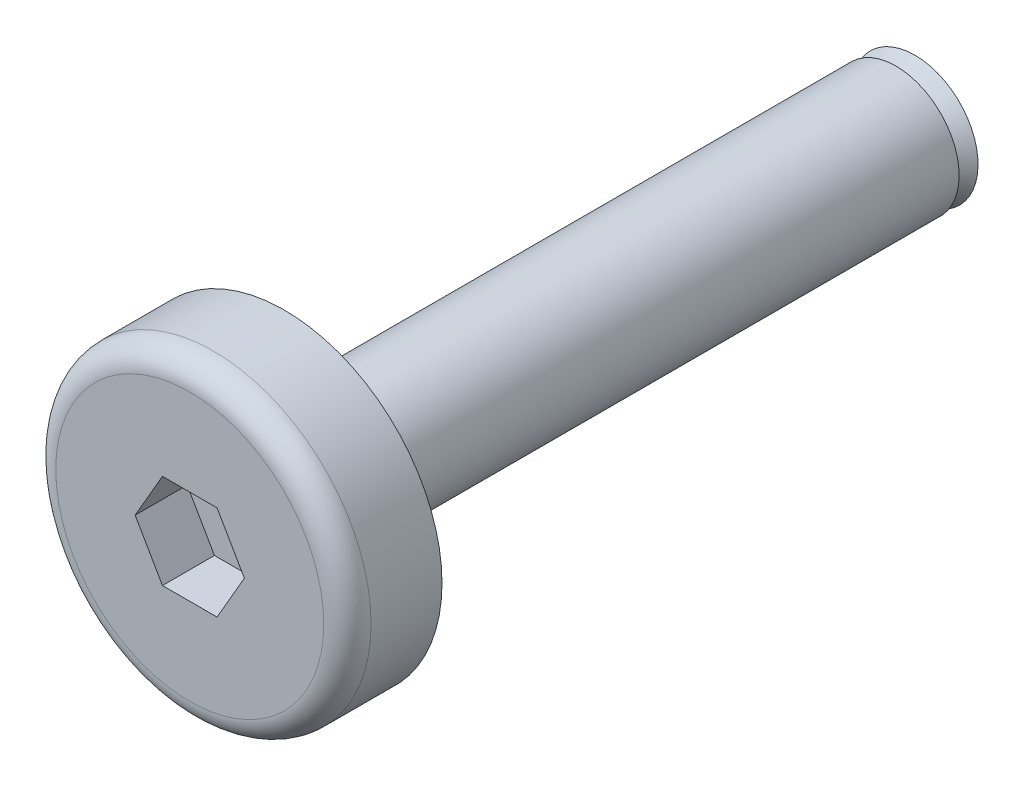
ISO-10303-21;
HEADER;
FILE_DESCRIPTION(('STEP AP214'),'2;1');
FILE_NAME('part.step','',(''),(''),'','','');
FILE_SCHEMA(('AUTOMOTIVE_DESIGN { 1 0 10303 214 1 1 1 1 }'));
ENDSEC;
DATA;
#1=APPLICATION_CONTEXT('core data for automotive mechanical design processes');
#2=APPLICATION_PROTOCOL_DEFINITION('international standard','automotive_design',2000,#1);
#3=PRODUCT_CONTEXT('',#1,'mechanical');
#4=PRODUCT('Part','Part','',(#3));
#5=PRODUCT_RELATED_PRODUCT_CATEGORY('part','',(#4));
#6=PRODUCT_DEFINITION_FORMATION('','',#4);
#7=PRODUCT_DEFINITION_CONTEXT('part definition',#1,'design');
#8=PRODUCT_DEFINITION('design','',#6,#7);
#9=PRODUCT_DEFINITION_SHAPE('','',#8);
#10=(LENGTH_UNIT() NAMED_UNIT(*) SI_UNIT(.MILLI.,.METRE.));
#11=(NAMED_UNIT(*) PLANE_ANGLE_UNIT() SI_UNIT($,.RADIAN.));
#12=(NAMED_UNIT(*) SI_UNIT($,.STERADIAN.) SOLID_ANGLE_UNIT());
#13=UNCERTAINTY_MEASURE_WITH_UNIT(LENGTH_MEASURE(1.E-05),#10,'distance_accuracy_value','');
#14=(GEOMETRIC_REPRESENTATION_CONTEXT(3) GLOBAL_UNCERTAINTY_ASSIGNED_CONTEXT((#13)) GLOBAL_UNIT_ASSIGNED_CONTEXT((#10,
#11,#12)) REPRESENTATION_CONTEXT('',''));
#15=CARTESIAN_POINT('',(0.,0.,0.));
#16=DIRECTION('',(0.,0.,1.));
#17=DIRECTION('',(1.,0.,0.));
#18=AXIS2_PLACEMENT_3D('',#15,#16,#17);
#19=CARTESIAN_POINT('',(0.,0.,1.5));
#20=DIRECTION('',(0.,0.,1.));
#21=DIRECTION('',(1.,0.,0.));
#22=AXIS2_PLACEMENT_3D('',#19,#20,#21);
#23=PLANE('',#22);
#24=CARTESIAN_POINT('',(0.,0.,1.5));
#25=DIRECTION('',(0.,0.,1.));
#26=DIRECTION('',(1.,0.,0.));
#27=AXIS2_PLACEMENT_3D('',#24,#25,#26);
#28=CIRCLE('',#27,2.125);
#29=CARTESIAN_POINT('',(2.125,0.,1.5));
#30=VERTEX_POINT('',#29);
#31=EDGE_CURVE('E142',#30,#30,#28,.T.);
#32=ORIENTED_EDGE('',*,*,#31,.T.);
#33=EDGE_LOOP('',(#32));
#34=FACE_BOUND('',#33,.T.);
#35=DIRECTION('',(0.5,-0.866025403784439,0.));
#36=VECTOR('',#35,1.);
#37=CARTESIAN_POINT('',(0.649519052838329,0.375,1.5));
#38=LINE('',#37,#36);
#39=CARTESIAN_POINT('',(0.433012701892219,0.75,1.5));
#40=VERTEX_POINT('',#39);
#41=CARTESIAN_POINT('',(0.866025403784439,0.,1.5));
#42=VERTEX_POINT('',#41);
#43=EDGE_CURVE('E51',#40,#42,#38,.T.);
#44=ORIENTED_EDGE('',*,*,#43,.T.);
#45=DIRECTION('',(-0.5,-0.866025403784439,0.));
#46=VECTOR('',#45,1.);
#47=CARTESIAN_POINT('',(0.649519052838329,-0.375,1.5));
#48=LINE('',#47,#46);
#49=CARTESIAN_POINT('',(0.433012701892219,-0.75,1.5));
#50=VERTEX_POINT('',#49);
#51=EDGE_CURVE('E11',#42,#50,#48,.T.);
#52=ORIENTED_EDGE('',*,*,#51,.T.);
#53=DIRECTION('',(-1.,0.,0.));
#54=VECTOR('',#53,1.);
#55=CARTESIAN_POINT('',(0.,-0.75,1.5));
#56=LINE('',#55,#54);
#57=CARTESIAN_POINT('',(-0.43301270189222,-0.75,1.5));
#58=VERTEX_POINT('',#57);
#59=EDGE_CURVE('E148',#50,#58,#56,.T.);
#60=ORIENTED_EDGE('',*,*,#59,.T.);
#61=DIRECTION('',(-0.5,0.866025403784439,0.));
#62=VECTOR('',#61,1.);
#63=CARTESIAN_POINT('',(-0.649519052838329,-0.375,1.5));
#64=LINE('',#63,#62);
#65=CARTESIAN_POINT('',(-0.866025403784439,0.,1.5));
#66=VERTEX_POINT('',#65);
#67=EDGE_CURVE('E151',#58,#66,#64,.T.);
#68=ORIENTED_EDGE('',*,*,#67,.T.);
#69=DIRECTION('',(0.5,0.866025403784438,0.));
#70=VECTOR('',#69,1.);
#71=CARTESIAN_POINT('',(-0.649519052838329,0.375,1.5));
#72=LINE('',#71,#70);
#73=CARTESIAN_POINT('',(-0.433012701892219,0.75,1.5));
#74=VERTEX_POINT('',#73);
#75=EDGE_CURVE('E154',#66,#74,#72,.T.);
#76=ORIENTED_EDGE('',*,*,#75,.T.);
#77=DIRECTION('',(1.,0.,0.));
#78=VECTOR('',#77,1.);
#79=CARTESIAN_POINT('',(0.,0.75,1.5));
#80=LINE('',#79,#78);
#81=EDGE_CURVE('E157',#74,#40,#80,.T.);
#82=ORIENTED_EDGE('',*,*,#81,.T.);
#83=EDGE_LOOP('',(#44,#52,#60,#68,#76,#82));
#84=FACE_BOUND('',#83,.T.);
#85=ADVANCED_FACE('F43',(#34,#84),#23,.T.);
#86=CARTESIAN_POINT('',(0.,0.,1.5));
#87=DIRECTION('',(0.,0.,-1.));
#88=DIRECTION('',(-1.,0.,0.));
#89=AXIS2_PLACEMENT_3D('',#86,#87,#88);
#90=CYLINDRICAL_SURFACE('',#89,2.5);
#91=CARTESIAN_POINT('',(0.,0.,1.125));
#92=DIRECTION('',(0.,0.,1.));
#93=DIRECTION('',(1.,0.,0.));
#94=AXIS2_PLACEMENT_3D('',#91,#92,#93);
#95=CIRCLE('',#94,2.5);
#96=CARTESIAN_POINT('',(2.5,0.,1.125));
#97=VERTEX_POINT('',#96);
#98=EDGE_CURVE('E145',#97,#97,#95,.F.);
#99=ORIENTED_EDGE('',*,*,#98,.T.);
#100=EDGE_LOOP('',(#99));
#101=FACE_BOUND('',#100,.T.);
#102=CARTESIAN_POINT('',(0.,0.,0.));
#103=DIRECTION('',(0.,0.,1.));
#104=DIRECTION('',(1.,0.,0.));
#105=AXIS2_PLACEMENT_3D('',#102,#103,#104);
#106=CIRCLE('',#105,2.5);
#107=CARTESIAN_POINT('',(2.5,0.,0.));
#108=VERTEX_POINT('',#107);
#109=EDGE_CURVE('E100',#108,#108,#106,.T.);
#110=ORIENTED_EDGE('',*,*,#109,.T.);
#111=EDGE_LOOP('',(#110));
#112=FACE_BOUND('',#111,.T.);
#113=ADVANCED_FACE('F181',(#101,#112),#90,.T.);
#114=CARTESIAN_POINT('',(0.,0.,0.));
#115=DIRECTION('',(0.,0.,1.));
#116=DIRECTION('',(1.,0.,0.));
#117=AXIS2_PLACEMENT_3D('',#114,#115,#116);
#118=PLANE('',#117);
#119=CARTESIAN_POINT('',(0.,0.,0.));
#120=DIRECTION('',(0.,0.,1.));
#121=DIRECTION('',(1.,0.,0.));
#122=AXIS2_PLACEMENT_3D('',#119,#120,#121);
#123=CIRCLE('',#122,1.);
#124=CARTESIAN_POINT('',(1.,0.,0.));
#125=VERTEX_POINT('',#124);
#126=EDGE_CURVE('E119',#125,#125,#123,.T.);
#127=ORIENTED_EDGE('',*,*,#126,.T.);
#128=EDGE_LOOP('',(#127));
#129=FACE_BOUND('',#128,.T.);
#130=ORIENTED_EDGE('',*,*,#109,.F.);
#131=EDGE_LOOP('',(#130));
#132=FACE_BOUND('',#131,.T.);
#133=ADVANCED_FACE('F187',(#129,#132),#118,.F.);
#134=CARTESIAN_POINT('',(0.,0.,1.125));
#135=DIRECTION('',(0.,0.,1.));
#136=DIRECTION('',(1.,0.,0.));
#137=AXIS2_PLACEMENT_3D('',#134,#135,#136);
#138=TOROIDAL_SURFACE('',#137,2.125,0.375);
#139=ORIENTED_EDGE('',*,*,#98,.F.);
#140=EDGE_LOOP('',(#139));
#141=FACE_BOUND('',#140,.T.);
#142=ORIENTED_EDGE('',*,*,#31,.F.);
#143=EDGE_LOOP('',(#142));
#144=FACE_BOUND('',#143,.T.);
#145=ADVANCED_FACE('F45',(#141,#144),#138,.T.);
#146=CARTESIAN_POINT('',(0.433012701892219,-0.75,1.51));
#147=DIRECTION('',(-0.866025403784439,0.5,0.));
#148=DIRECTION('',(-0.5,-0.866025403784439,0.));
#149=AXIS2_PLACEMENT_3D('',#146,#147,#148);
#150=PLANE('',#149);
#151=DIRECTION('',(0.,0.,-1.));
#152=VECTOR('',#151,1.);
#153=CARTESIAN_POINT('',(0.866025403784439,0.,1.51));
#154=LINE('',#153,#152);
#155=CARTESIAN_POINT('',(0.866025403784439,0.,0.675));
#156=VERTEX_POINT('',#155);
#157=EDGE_CURVE('E93',#42,#156,#154,.T.);
#158=ORIENTED_EDGE('',*,*,#157,.T.);
#159=DIRECTION('',(0.5,0.866025403784439,0.));
#160=VECTOR('',#159,1.);
#161=CARTESIAN_POINT('',(0.433012701892219,-0.75,0.675));
#162=LINE('',#161,#160);
#163=CARTESIAN_POINT('',(0.433012701892219,-0.75,0.675));
#164=VERTEX_POINT('',#163);
#165=EDGE_CURVE('E97',#164,#156,#162,.T.);
#166=ORIENTED_EDGE('',*,*,#165,.F.);
#167=DIRECTION('',(0.,0.,-1.));
#168=VECTOR('',#167,1.);
#169=CARTESIAN_POINT('',(0.433012701892219,-0.75,1.51));
#170=LINE('',#169,#168);
#171=EDGE_CURVE('E132',#50,#164,#170,.T.);
#172=ORIENTED_EDGE('',*,*,#171,.F.);
#173=ORIENTED_EDGE('',*,*,#51,.F.);
#174=EDGE_LOOP('',(#158,#166,#172,#173));
#175=FACE_BOUND('',#174,.T.);
#176=ADVANCED_FACE('F95',(#175),#150,.T.);
#177=CARTESIAN_POINT('',(0.866025403784439,0.,1.51));
#178=DIRECTION('',(-0.866025403784439,-0.5,0.));
#179=DIRECTION('',(0.,0.,1.));
#180=AXIS2_PLACEMENT_3D('',#177,#178,#179);
#181=PLANE('',#180);
#182=DIRECTION('',(0.,0.,-1.));
#183=VECTOR('',#182,1.);
#184=CARTESIAN_POINT('',(0.433012701892219,0.75,1.51));
#185=LINE('',#184,#183);
#186=CARTESIAN_POINT('',(0.433012701892219,0.75,0.675));
#187=VERTEX_POINT('',#186);
#188=EDGE_CURVE('E101',#40,#187,#185,.T.);
#189=ORIENTED_EDGE('',*,*,#188,.T.);
#190=DIRECTION('',(-0.5,0.866025403784439,0.));
#191=VECTOR('',#190,1.);
#192=CARTESIAN_POINT('',(0.866025403784439,0.,0.675));
#193=LINE('',#192,#191);
#194=EDGE_CURVE('E104',#156,#187,#193,.T.);
#195=ORIENTED_EDGE('',*,*,#194,.F.);
#196=ORIENTED_EDGE('',*,*,#157,.F.);
#197=ORIENTED_EDGE('',*,*,#43,.F.);
#198=EDGE_LOOP('',(#189,#195,#196,#197));
#199=FACE_BOUND('',#198,.T.);
#200=ADVANCED_FACE('F105',(#199),#181,.T.);
#201=CARTESIAN_POINT('',(0.433012701892219,0.75,1.51));
#202=DIRECTION('',(0.,-1.,0.));
#203=DIRECTION('',(1.,0.,0.));
#204=AXIS2_PLACEMENT_3D('',#201,#202,#203);
#205=PLANE('',#204);
#206=DIRECTION('',(0.,0.,-1.));
#207=VECTOR('',#206,1.);
#208=CARTESIAN_POINT('',(-0.433012701892219,0.75,1.51));
#209=LINE('',#208,#207);
#210=CARTESIAN_POINT('',(-0.433012701892219,0.75,0.675));
#211=VERTEX_POINT('',#210);
#212=EDGE_CURVE('E137',#74,#211,#209,.T.);
#213=ORIENTED_EDGE('',*,*,#212,.T.);
#214=DIRECTION('',(-1.,0.,0.));
#215=VECTOR('',#214,1.);
#216=CARTESIAN_POINT('',(0.433012701892219,0.75,0.675));
#217=LINE('',#216,#215);
#218=EDGE_CURVE('E110',#187,#211,#217,.T.);
#219=ORIENTED_EDGE('',*,*,#218,.F.);
#220=ORIENTED_EDGE('',*,*,#188,.F.);
#221=ORIENTED_EDGE('',*,*,#81,.F.);
#222=EDGE_LOOP('',(#213,#219,#220,#221));
#223=FACE_BOUND('',#222,.T.);
#224=ADVANCED_FACE('F161',(#223),#205,.T.);
#225=CARTESIAN_POINT('',(-0.433012701892219,0.75,1.51));
#226=DIRECTION('',(0.866025403784439,-0.5,0.));
#227=DIRECTION('',(0.500000000000001,0.866025403784439,0.));
#228=AXIS2_PLACEMENT_3D('',#225,#226,#227);
#229=PLANE('',#228);
#230=DIRECTION('',(0.,0.,-1.));
#231=VECTOR('',#230,1.);
#232=CARTESIAN_POINT('',(-0.866025403784439,0.,1.51));
#233=LINE('',#232,#231);
#234=CARTESIAN_POINT('',(-0.866025403784439,0.,0.675));
#235=VERTEX_POINT('',#234);
#236=EDGE_CURVE('E135',#66,#235,#233,.T.);
#237=ORIENTED_EDGE('',*,*,#236,.T.);
#238=DIRECTION('',(-0.5,-0.866025403784439,0.));
#239=VECTOR('',#238,1.);
#240=CARTESIAN_POINT('',(-0.433012701892219,0.75,0.675));
#241=LINE('',#240,#239);
#242=EDGE_CURVE('E126',#211,#235,#241,.T.);
#243=ORIENTED_EDGE('',*,*,#242,.F.);
#244=ORIENTED_EDGE('',*,*,#212,.F.);
#245=ORIENTED_EDGE('',*,*,#75,.F.);
#246=EDGE_LOOP('',(#237,#243,#244,#245));
#247=FACE_BOUND('',#246,.T.);
#248=ADVANCED_FACE('F166',(#247),#229,.T.);
#249=CARTESIAN_POINT('',(-0.866025403784439,0.,1.51));
#250=DIRECTION('',(0.866025403784439,0.5,0.));
#251=DIRECTION('',(0.,0.,-1.));
#252=AXIS2_PLACEMENT_3D('',#249,#250,#251);
#253=PLANE('',#252);
#254=DIRECTION('',(0.,0.,-1.));
#255=VECTOR('',#254,1.);
#256=CARTESIAN_POINT('',(-0.43301270189222,-0.75,1.51));
#257=LINE('',#256,#255);
#258=CARTESIAN_POINT('',(-0.43301270189222,-0.75,0.675));
#259=VERTEX_POINT('',#258);
#260=EDGE_CURVE('E58',#58,#259,#257,.T.);
#261=ORIENTED_EDGE('',*,*,#260,.T.);
#262=DIRECTION('',(0.5,-0.866025403784439,0.));
#263=VECTOR('',#262,1.);
#264=CARTESIAN_POINT('',(-0.866025403784439,0.,0.675));
#265=LINE('',#264,#263);
#266=EDGE_CURVE('E129',#235,#259,#265,.T.);
#267=ORIENTED_EDGE('',*,*,#266,.F.);
#268=ORIENTED_EDGE('',*,*,#236,.F.);
#269=ORIENTED_EDGE('',*,*,#67,.F.);
#270=EDGE_LOOP('',(#261,#267,#268,#269));
#271=FACE_BOUND('',#270,.T.);
#272=ADVANCED_FACE('F169',(#271),#253,.T.);
#273=CARTESIAN_POINT('',(-0.43301270189222,-0.75,1.51));
#274=DIRECTION('',(0.,1.,0.));
#275=DIRECTION('',(-1.,0.,0.));
#276=AXIS2_PLACEMENT_3D('',#273,#274,#275);
#277=PLANE('',#276);
#278=ORIENTED_EDGE('',*,*,#171,.T.);
#279=DIRECTION('',(1.,0.,0.));
#280=VECTOR('',#279,1.);
#281=CARTESIAN_POINT('',(-0.43301270189222,-0.75,0.675));
#282=LINE('',#281,#280);
#283=EDGE_CURVE('E115',#259,#164,#282,.T.);
#284=ORIENTED_EDGE('',*,*,#283,.F.);
#285=ORIENTED_EDGE('',*,*,#260,.F.);
#286=ORIENTED_EDGE('',*,*,#59,.F.);
#287=EDGE_LOOP('',(#278,#284,#285,#286));
#288=FACE_BOUND('',#287,.T.);
#289=ADVANCED_FACE('F170',(#288),#277,.T.);
#290=CARTESIAN_POINT('',(0.866025403784439,0.,0.675));
#291=DIRECTION('',(0.,0.,1.));
#292=DIRECTION('',(-0.5,0.866025403784439,0.));
#293=AXIS2_PLACEMENT_3D('',#290,#291,#292);
#294=PLANE('',#293);
#295=ORIENTED_EDGE('',*,*,#165,.T.);
#296=ORIENTED_EDGE('',*,*,#194,.T.);
#297=ORIENTED_EDGE('',*,*,#218,.T.);
#298=ORIENTED_EDGE('',*,*,#242,.T.);
#299=ORIENTED_EDGE('',*,*,#266,.T.);
#300=ORIENTED_EDGE('',*,*,#283,.T.);
#301=EDGE_LOOP('',(#295,#296,#297,#298,#299,#300));
#302=FACE_BOUND('',#301,.T.);
#303=ADVANCED_FACE('F113',(#302),#294,.T.);
#304=CARTESIAN_POINT('',(0.,0.,0.));
#305=DIRECTION('',(0.,0.,-1.));
#306=DIRECTION('',(-1.,0.,0.));
#307=AXIS2_PLACEMENT_3D('',#304,#305,#306);
#308=CYLINDRICAL_SURFACE('',#307,1.);
#309=ORIENTED_EDGE('',*,*,#126,.F.);
#310=EDGE_LOOP('',(#309));
#311=FACE_BOUND('',#310,.T.);
#312=CARTESIAN_POINT('',(0.,0.,-9.7));
#313=DIRECTION('',(0.,0.,1.));
#314=DIRECTION('',(1.,0.,0.));
#315=AXIS2_PLACEMENT_3D('',#312,#313,#314);
#316=CIRCLE('',#315,1.);
#317=CARTESIAN_POINT('',(1.,0.,-9.7));
#318=VERTEX_POINT('',#317);
#319=EDGE_CURVE('E122',#318,#318,#316,.T.);
#320=ORIENTED_EDGE('',*,*,#319,.T.);
#321=EDGE_LOOP('',(#320));
#322=FACE_BOUND('',#321,.T.);
#323=ADVANCED_FACE('F177',(#311,#322),#308,.T.);
#324=CARTESIAN_POINT('',(0.,0.,-9.7));
#325=DIRECTION('',(0.,0.,1.));
#326=DIRECTION('',(1.,0.,0.));
#327=AXIS2_PLACEMENT_3D('',#324,#325,#326);
#328=PLANE('',#327);
#329=CARTESIAN_POINT('',(0.,0.,-9.7));
#330=DIRECTION('',(0.,0.,-1.));
#331=DIRECTION('',(0.,1.,0.));
#332=AXIS2_PLACEMENT_3D('',#329,#330,#331);
#333=CIRCLE('',#332,0.7);
#334=CARTESIAN_POINT('',(0.,0.7,-9.7));
#335=VERTEX_POINT('',#334);
#336=EDGE_CURVE('E116',#335,#335,#333,.T.);
#337=ORIENTED_EDGE('',*,*,#336,.F.);
#338=EDGE_LOOP('',(#337));
#339=FACE_BOUND('',#338,.T.);
#340=ORIENTED_EDGE('',*,*,#319,.F.);
#341=EDGE_LOOP('',(#340));
#342=FACE_BOUND('',#341,.T.);
#343=ADVANCED_FACE('F219',(#339,#342),#328,.F.);
#344=CARTESIAN_POINT('',(0.,0.,-10.));
#345=DIRECTION('',(0.,0.,-1.));
#346=DIRECTION('',(0.,1.,0.));
#347=AXIS2_PLACEMENT_3D('',#344,#345,#346);
#348=PLANE('',#347);
#349=CARTESIAN_POINT('',(0.,0.,-10.));
#350=DIRECTION('',(0.,0.,-1.));
#351=DIRECTION('',(0.,1.,0.));
#352=AXIS2_PLACEMENT_3D('',#349,#350,#351);
#353=CIRCLE('',#352,1.);
#354=CARTESIAN_POINT('',(0.,1.,-10.));
#355=VERTEX_POINT('',#354);
#356=EDGE_CURVE('E205',#355,#355,#353,.T.);
#357=ORIENTED_EDGE('',*,*,#356,.T.);
#358=EDGE_LOOP('',(#357));
#359=FACE_BOUND('',#358,.T.);
#360=ADVANCED_FACE('F210',(#359),#348,.T.);
#361=CARTESIAN_POINT('',(0.,0.,-10.));
#362=DIRECTION('',(0.,0.,-1.));
#363=DIRECTION('',(0.,1.,0.));
#364=AXIS2_PLACEMENT_3D('',#361,#362,#363);
#365=CONICAL_SURFACE('',#364,1.,0.785398163397457);
#366=ORIENTED_EDGE('',*,*,#336,.T.);
#367=EDGE_LOOP('',(#366));
#368=FACE_BOUND('',#367,.T.);
#369=ORIENTED_EDGE('',*,*,#356,.F.);
#370=EDGE_LOOP('',(#369));
#371=FACE_BOUND('',#370,.T.);
#372=ADVANCED_FACE('F212',(#368,#371),#365,.T.);
#373=CLOSED_SHELL('',(#85,#113,#133,#145,#176,#200,#224,#248,#272,#289,#303,#323,#343,#360,#372));
#374=MANIFOLD_SOLID_BREP('B2',#373);
#375=ADVANCED_BREP_SHAPE_REPRESENTATION('',(#18,#374),#14);
#376=SHAPE_DEFINITION_REPRESENTATION(#9,#375);
ENDSEC;
END-ISO-10303-21;
